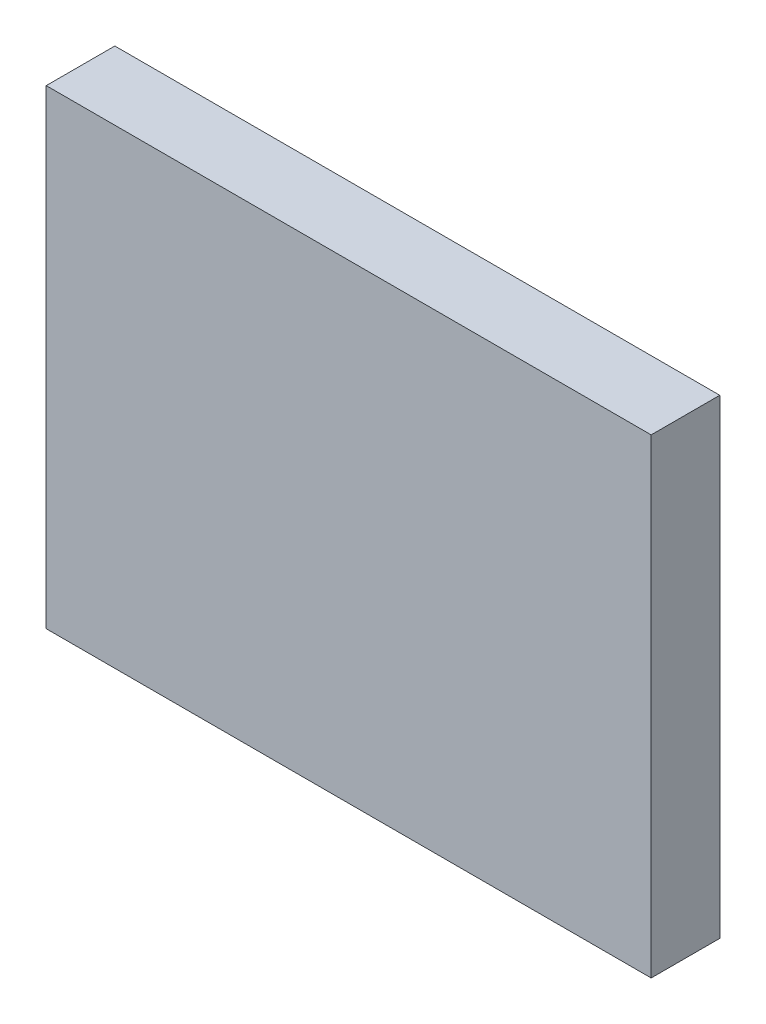
ISO-10303-21;
HEADER;
FILE_DESCRIPTION(('STEP AP214'),'2;1');
FILE_NAME('part.step','',(''),(''),'','','');
FILE_SCHEMA(('AUTOMOTIVE_DESIGN { 1 0 10303 214 1 1 1 1 }'));
ENDSEC;
DATA;
#1=APPLICATION_CONTEXT('core data for automotive mechanical design processes');
#2=APPLICATION_PROTOCOL_DEFINITION('international standard','automotive_design',2000,#1);
#3=PRODUCT_CONTEXT('',#1,'mechanical');
#4=PRODUCT('Part','Part','',(#3));
#5=PRODUCT_RELATED_PRODUCT_CATEGORY('part','',(#4));
#6=PRODUCT_DEFINITION_FORMATION('','',#4);
#7=PRODUCT_DEFINITION_CONTEXT('part definition',#1,'design');
#8=PRODUCT_DEFINITION('design','',#6,#7);
#9=PRODUCT_DEFINITION_SHAPE('','',#8);
#10=(LENGTH_UNIT() NAMED_UNIT(*) SI_UNIT(.MILLI.,.METRE.));
#11=(NAMED_UNIT(*) PLANE_ANGLE_UNIT() SI_UNIT($,.RADIAN.));
#12=(NAMED_UNIT(*) SI_UNIT($,.STERADIAN.) SOLID_ANGLE_UNIT());
#13=UNCERTAINTY_MEASURE_WITH_UNIT(LENGTH_MEASURE(1.E-05),#10,'distance_accuracy_value','');
#14=(GEOMETRIC_REPRESENTATION_CONTEXT(3) GLOBAL_UNCERTAINTY_ASSIGNED_CONTEXT((#13)) GLOBAL_UNIT_ASSIGNED_CONTEXT((#10,
#11,#12)) REPRESENTATION_CONTEXT('',''));
#15=CARTESIAN_POINT('',(0.,0.,0.));
#16=DIRECTION('',(0.,0.,1.));
#17=DIRECTION('',(1.,0.,0.));
#18=AXIS2_PLACEMENT_3D('',#15,#16,#17);
#19=CARTESIAN_POINT('',(-6.35,40.,6.35));
#20=DIRECTION('',(1.,0.,0.));
#21=DIRECTION('',(0.,0.,-1.));
#22=AXIS2_PLACEMENT_3D('',#19,#20,#21);
#23=PLANE('',#22);
#24=DIRECTION('',(0.,-1.,0.));
#25=VECTOR('',#24,1.);
#26=CARTESIAN_POINT('',(-6.35,40.,0.));
#27=LINE('',#26,#25);
#28=CARTESIAN_POINT('',(-6.35,40.,0.));
#29=VERTEX_POINT('',#28);
#30=CARTESIAN_POINT('',(-6.35,-3.54256213049098,0.));
#31=VERTEX_POINT('',#30);
#32=EDGE_CURVE('E96',#29,#31,#27,.T.);
#33=ORIENTED_EDGE('',*,*,#32,.T.);
#34=DIRECTION('',(0.,0.,-1.));
#35=VECTOR('',#34,1.);
#36=CARTESIAN_POINT('',(-6.35,-3.54256213049098,6.35));
#37=LINE('',#36,#35);
#38=CARTESIAN_POINT('',(-6.35,-3.54256213049098,6.35));
#39=VERTEX_POINT('',#38);
#40=EDGE_CURVE('E11',#39,#31,#37,.T.);
#41=ORIENTED_EDGE('',*,*,#40,.F.);
#42=DIRECTION('',(0.,-1.,0.));
#43=VECTOR('',#42,1.);
#44=CARTESIAN_POINT('',(-6.35,40.,6.35));
#45=LINE('',#44,#43);
#46=CARTESIAN_POINT('',(-6.35,40.,6.35));
#47=VERTEX_POINT('',#46);
#48=EDGE_CURVE('E84',#47,#39,#45,.T.);
#49=ORIENTED_EDGE('',*,*,#48,.F.);
#50=DIRECTION('',(0.,0.,-1.));
#51=VECTOR('',#50,1.);
#52=CARTESIAN_POINT('',(-6.35,40.,6.35));
#53=LINE('',#52,#51);
#54=EDGE_CURVE('E92',#47,#29,#53,.T.);
#55=ORIENTED_EDGE('',*,*,#54,.T.);
#56=EDGE_LOOP('',(#33,#41,#49,#55));
#57=FACE_BOUND('',#56,.T.);
#58=ADVANCED_FACE('F33',(#57),#23,.F.);
#59=CARTESIAN_POINT('',(-6.35,-3.54256213049098,6.35));
#60=DIRECTION('',(0.,1.,0.));
#61=DIRECTION('',(0.,0.,1.));
#62=AXIS2_PLACEMENT_3D('',#59,#60,#61);
#63=PLANE('',#62);
#64=DIRECTION('',(1.,0.,0.));
#65=VECTOR('',#64,1.);
#66=CARTESIAN_POINT('',(-6.35,-3.54256213049098,0.));
#67=LINE('',#66,#65);
#68=CARTESIAN_POINT('',(49.65,-3.54256213049098,0.));
#69=VERTEX_POINT('',#68);
#70=EDGE_CURVE('E88',#31,#69,#67,.T.);
#71=ORIENTED_EDGE('',*,*,#70,.T.);
#72=DIRECTION('',(0.,0.,-1.));
#73=VECTOR('',#72,1.);
#74=CARTESIAN_POINT('',(49.65,-3.54256213049098,6.35));
#75=LINE('',#74,#73);
#76=CARTESIAN_POINT('',(49.65,-3.54256213049098,6.35));
#77=VERTEX_POINT('',#76);
#78=EDGE_CURVE('E41',#77,#69,#75,.T.);
#79=ORIENTED_EDGE('',*,*,#78,.F.);
#80=DIRECTION('',(1.,0.,0.));
#81=VECTOR('',#80,1.);
#82=CARTESIAN_POINT('',(-6.35,-3.54256213049098,6.35));
#83=LINE('',#82,#81);
#84=EDGE_CURVE('E79',#39,#77,#83,.T.);
#85=ORIENTED_EDGE('',*,*,#84,.F.);
#86=ORIENTED_EDGE('',*,*,#40,.T.);
#87=EDGE_LOOP('',(#71,#79,#85,#86));
#88=FACE_BOUND('',#87,.T.);
#89=ADVANCED_FACE('F87',(#88),#63,.F.);
#90=CARTESIAN_POINT('',(49.65,40.,6.35));
#91=DIRECTION('',(-1.,0.,0.));
#92=DIRECTION('',(0.,0.,1.));
#93=AXIS2_PLACEMENT_3D('',#90,#91,#92);
#94=PLANE('',#93);
#95=DIRECTION('',(0.,1.,0.));
#96=VECTOR('',#95,1.);
#97=CARTESIAN_POINT('',(49.65,40.,0.));
#98=LINE('',#97,#96);
#99=CARTESIAN_POINT('',(49.65,40.,0.));
#100=VERTEX_POINT('',#99);
#101=EDGE_CURVE('E66',#69,#100,#98,.T.);
#102=ORIENTED_EDGE('',*,*,#101,.T.);
#103=DIRECTION('',(0.,0.,-1.));
#104=VECTOR('',#103,1.);
#105=CARTESIAN_POINT('',(49.65,40.,6.35));
#106=LINE('',#105,#104);
#107=CARTESIAN_POINT('',(49.65,40.,6.35));
#108=VERTEX_POINT('',#107);
#109=EDGE_CURVE('E89',#108,#100,#106,.T.);
#110=ORIENTED_EDGE('',*,*,#109,.F.);
#111=DIRECTION('',(0.,1.,0.));
#112=VECTOR('',#111,1.);
#113=CARTESIAN_POINT('',(49.65,40.,6.35));
#114=LINE('',#113,#112);
#115=EDGE_CURVE('E82',#77,#108,#114,.T.);
#116=ORIENTED_EDGE('',*,*,#115,.F.);
#117=ORIENTED_EDGE('',*,*,#78,.T.);
#118=EDGE_LOOP('',(#102,#110,#116,#117));
#119=FACE_BOUND('',#118,.T.);
#120=ADVANCED_FACE('F90',(#119),#94,.F.);
#121=CARTESIAN_POINT('',(-6.35,40.,6.35));
#122=DIRECTION('',(0.,-1.,0.));
#123=DIRECTION('',(0.,0.,-1.));
#124=AXIS2_PLACEMENT_3D('',#121,#122,#123);
#125=PLANE('',#124);
#126=DIRECTION('',(-1.,0.,0.));
#127=VECTOR('',#126,1.);
#128=CARTESIAN_POINT('',(-6.35,40.,0.));
#129=LINE('',#128,#127);
#130=EDGE_CURVE('E72',#100,#29,#129,.T.);
#131=ORIENTED_EDGE('',*,*,#130,.T.);
#132=ORIENTED_EDGE('',*,*,#54,.F.);
#133=DIRECTION('',(-1.,0.,0.));
#134=VECTOR('',#133,1.);
#135=CARTESIAN_POINT('',(-6.35,40.,6.35));
#136=LINE('',#135,#134);
#137=EDGE_CURVE('E49',#108,#47,#136,.T.);
#138=ORIENTED_EDGE('',*,*,#137,.F.);
#139=ORIENTED_EDGE('',*,*,#109,.T.);
#140=EDGE_LOOP('',(#131,#132,#138,#139));
#141=FACE_BOUND('',#140,.T.);
#142=ADVANCED_FACE('F103',(#141),#125,.F.);
#143=CARTESIAN_POINT('',(0.,0.,6.35));
#144=DIRECTION('',(0.,0.,1.));
#145=DIRECTION('',(1.,0.,0.));
#146=AXIS2_PLACEMENT_3D('',#143,#144,#145);
#147=PLANE('',#146);
#148=ORIENTED_EDGE('',*,*,#48,.T.);
#149=ORIENTED_EDGE('',*,*,#84,.T.);
#150=ORIENTED_EDGE('',*,*,#115,.T.);
#151=ORIENTED_EDGE('',*,*,#137,.T.);
#152=EDGE_LOOP('',(#148,#149,#150,#151));
#153=FACE_BOUND('',#152,.T.);
#154=ADVANCED_FACE('F80',(#153),#147,.T.);
#155=CARTESIAN_POINT('',(0.,0.,0.));
#156=DIRECTION('',(0.,0.,1.));
#157=DIRECTION('',(1.,0.,0.));
#158=AXIS2_PLACEMENT_3D('',#155,#156,#157);
#159=PLANE('',#158);
#160=ORIENTED_EDGE('',*,*,#32,.F.);
#161=ORIENTED_EDGE('',*,*,#130,.F.);
#162=ORIENTED_EDGE('',*,*,#101,.F.);
#163=ORIENTED_EDGE('',*,*,#70,.F.);
#164=EDGE_LOOP('',(#160,#161,#162,#163));
#165=FACE_BOUND('',#164,.T.);
#166=ADVANCED_FACE('F106',(#165),#159,.F.);
#167=CLOSED_SHELL('',(#58,#89,#120,#142,#154,#166));
#168=MANIFOLD_SOLID_BREP('B2',#167);
#169=ADVANCED_BREP_SHAPE_REPRESENTATION('',(#18,#168),#14);
#170=SHAPE_DEFINITION_REPRESENTATION(#9,#169);
ENDSEC;
END-ISO-10303-21;
